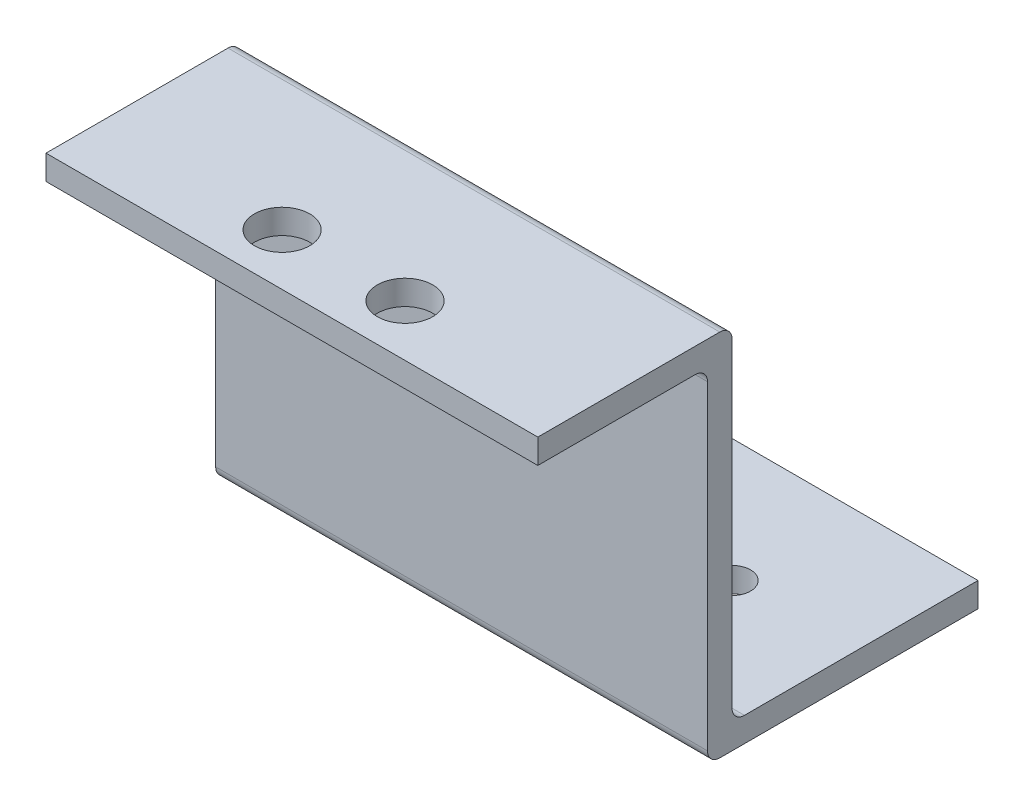
ISO-10303-21;
HEADER;
FILE_DESCRIPTION(('STEP AP214'),'2;1');
FILE_NAME('part.step','',(''),(''),'','','');
FILE_SCHEMA(('AUTOMOTIVE_DESIGN { 1 0 10303 214 1 1 1 1 }'));
ENDSEC;
DATA;
#1=APPLICATION_CONTEXT('core data for automotive mechanical design processes');
#2=APPLICATION_PROTOCOL_DEFINITION('international standard','automotive_design',2000,#1);
#3=PRODUCT_CONTEXT('',#1,'mechanical');
#4=PRODUCT('Part','Part','',(#3));
#5=PRODUCT_RELATED_PRODUCT_CATEGORY('part','',(#4));
#6=PRODUCT_DEFINITION_FORMATION('','',#4);
#7=PRODUCT_DEFINITION_CONTEXT('part definition',#1,'design');
#8=PRODUCT_DEFINITION('design','',#6,#7);
#9=PRODUCT_DEFINITION_SHAPE('','',#8);
#10=(LENGTH_UNIT() NAMED_UNIT(*) SI_UNIT(.MILLI.,.METRE.));
#11=(NAMED_UNIT(*) PLANE_ANGLE_UNIT() SI_UNIT($,.RADIAN.));
#12=(NAMED_UNIT(*) SI_UNIT($,.STERADIAN.) SOLID_ANGLE_UNIT());
#13=UNCERTAINTY_MEASURE_WITH_UNIT(LENGTH_MEASURE(1.E-05),#10,'distance_accuracy_value','');
#14=(GEOMETRIC_REPRESENTATION_CONTEXT(3) GLOBAL_UNCERTAINTY_ASSIGNED_CONTEXT((#13)) GLOBAL_UNIT_ASSIGNED_CONTEXT((#10,
#11,#12)) REPRESENTATION_CONTEXT('',''));
#15=CARTESIAN_POINT('',(0.,0.,0.));
#16=DIRECTION('',(0.,0.,1.));
#17=DIRECTION('',(1.,0.,0.));
#18=AXIS2_PLACEMENT_3D('',#15,#16,#17);
#19=CARTESIAN_POINT('',(20.7359824874377,-25.,-36.6320087562811));
#20=DIRECTION('',(1.,0.,0.));
#21=DIRECTION('',(0.,0.,-1.));
#22=AXIS2_PLACEMENT_3D('',#19,#20,#21);
#23=CYLINDRICAL_SURFACE('',#22,1.);
#24=CARTESIAN_POINT('',(-17.2640175125623,-25.,-36.6320087562811));
#25=DIRECTION('',(-1.,0.,0.));
#26=DIRECTION('',(0.,0.,1.));
#27=AXIS2_PLACEMENT_3D('',#24,#25,#26);
#28=CIRCLE('',#27,1.);
#29=CARTESIAN_POINT('',(-17.2640175125623,-25.,-35.6320087562811));
#30=VERTEX_POINT('',#29);
#31=CARTESIAN_POINT('',(-17.2640175125623,-26.,-36.6320087562811));
#32=VERTEX_POINT('',#31);
#33=EDGE_CURVE('E137',#30,#32,#28,.F.);
#34=ORIENTED_EDGE('',*,*,#33,.F.);
#35=DIRECTION('',(1.,0.,0.));
#36=VECTOR('',#35,1.);
#37=CARTESIAN_POINT('',(20.7359824874377,-25.,-35.6320087562811));
#38=LINE('',#37,#36);
#39=CARTESIAN_POINT('',(20.7359824874377,-25.,-35.6320087562811));
#40=VERTEX_POINT('',#39);
#41=EDGE_CURVE('E165',#40,#30,#38,.F.);
#42=ORIENTED_EDGE('',*,*,#41,.F.);
#43=CARTESIAN_POINT('',(20.7359824874377,-25.,-36.6320087562811));
#44=DIRECTION('',(1.,0.,0.));
#45=DIRECTION('',(0.,0.,-1.));
#46=AXIS2_PLACEMENT_3D('',#43,#44,#45);
#47=CIRCLE('',#46,1.);
#48=CARTESIAN_POINT('',(20.7359824874377,-26.,-36.6320087562811));
#49=VERTEX_POINT('',#48);
#50=EDGE_CURVE('E160',#49,#40,#47,.F.);
#51=ORIENTED_EDGE('',*,*,#50,.F.);
#52=DIRECTION('',(1.,0.,0.));
#53=VECTOR('',#52,1.);
#54=CARTESIAN_POINT('',(20.7359824874377,-26.,-36.6320087562811));
#55=LINE('',#54,#53);
#56=EDGE_CURVE('E155',#32,#49,#55,.T.);
#57=ORIENTED_EDGE('',*,*,#56,.F.);
#58=EDGE_LOOP('',(#34,#42,#51,#57));
#59=FACE_BOUND('',#58,.T.);
#60=ADVANCED_FACE('F37',(#59),#23,.F.);
#61=CARTESIAN_POINT('',(20.7359824874377,2.,0.));
#62=DIRECTION('',(1.,0.,0.));
#63=DIRECTION('',(0.,0.,-1.));
#64=AXIS2_PLACEMENT_3D('',#61,#62,#63);
#65=PLANE('',#64);
#66=DIRECTION('',(0.,0.,1.));
#67=VECTOR('',#66,1.);
#68=CARTESIAN_POINT('',(20.7359824874377,2.,0.));
#69=LINE('',#68,#67);
#70=CARTESIAN_POINT('',(20.7359824874377,2.,-34.6320087562811));
#71=VERTEX_POINT('',#70);
#72=CARTESIAN_POINT('',(20.7359824874377,2.,-19.8320087562811));
#73=VERTEX_POINT('',#72);
#74=EDGE_CURVE('E247',#71,#73,#69,.T.);
#75=ORIENTED_EDGE('',*,*,#74,.T.);
#76=DIRECTION('',(0.,-1.,0.));
#77=VECTOR('',#76,1.);
#78=CARTESIAN_POINT('',(20.7359824874377,2.,-19.8320087562811));
#79=LINE('',#78,#77);
#80=CARTESIAN_POINT('',(20.7359824874377,0.,-19.8320087562811));
#81=VERTEX_POINT('',#80);
#82=EDGE_CURVE('E259',#73,#81,#79,.T.);
#83=ORIENTED_EDGE('',*,*,#82,.T.);
#84=DIRECTION('',(0.,0.,1.));
#85=VECTOR('',#84,1.);
#86=CARTESIAN_POINT('',(20.7359824874377,0.,0.));
#87=LINE('',#86,#85);
#88=CARTESIAN_POINT('',(20.7359824874377,0.,-32.6320087562811));
#89=VERTEX_POINT('',#88);
#90=EDGE_CURVE('E186',#89,#81,#87,.T.);
#91=ORIENTED_EDGE('',*,*,#90,.F.);
#92=CARTESIAN_POINT('',(20.7359824874377,-1.,-32.6320087562811));
#93=DIRECTION('',(1.,0.,0.));
#94=DIRECTION('',(0.,0.,-1.));
#95=AXIS2_PLACEMENT_3D('',#92,#93,#94);
#96=CIRCLE('',#95,1.);
#97=CARTESIAN_POINT('',(20.7359824874377,-1.,-33.6320087562811));
#98=VERTEX_POINT('',#97);
#99=EDGE_CURVE('E45',#89,#98,#96,.F.);
#100=ORIENTED_EDGE('',*,*,#99,.T.);
#101=DIRECTION('',(0.,1.,0.));
#102=VECTOR('',#101,1.);
#103=CARTESIAN_POINT('',(20.7359824874377,-28.,-33.6320087562811));
#104=LINE('',#103,#102);
#105=CARTESIAN_POINT('',(20.7359824874377,-27.,-33.6320087562811));
#106=VERTEX_POINT('',#105);
#107=EDGE_CURVE('E184',#106,#98,#104,.T.);
#108=ORIENTED_EDGE('',*,*,#107,.F.);
#109=CARTESIAN_POINT('',(20.7359824874377,-27.,-34.6320087562811));
#110=DIRECTION('',(1.,0.,0.));
#111=DIRECTION('',(0.,0.,-1.));
#112=AXIS2_PLACEMENT_3D('',#109,#110,#111);
#113=CIRCLE('',#112,1.);
#114=CARTESIAN_POINT('',(20.7359824874377,-28.,-34.6320087562811));
#115=VERTEX_POINT('',#114);
#116=EDGE_CURVE('E210',#106,#115,#113,.T.);
#117=ORIENTED_EDGE('',*,*,#116,.T.);
#118=DIRECTION('',(0.,0.,-1.));
#119=VECTOR('',#118,1.);
#120=CARTESIAN_POINT('',(20.7359824874377,-28.,-33.6320087562811));
#121=LINE('',#120,#119);
#122=CARTESIAN_POINT('',(20.7359824874377,-28.,-55.6320087562811));
#123=VERTEX_POINT('',#122);
#124=EDGE_CURVE('E237',#115,#123,#121,.T.);
#125=ORIENTED_EDGE('',*,*,#124,.T.);
#126=DIRECTION('',(0.,-1.,0.));
#127=VECTOR('',#126,1.);
#128=CARTESIAN_POINT('',(20.7359824874377,-28.,-55.6320087562811));
#129=LINE('',#128,#127);
#130=CARTESIAN_POINT('',(20.7359824874377,-26.,-55.6320087562811));
#131=VERTEX_POINT('',#130);
#132=EDGE_CURVE('E320',#131,#123,#129,.T.);
#133=ORIENTED_EDGE('',*,*,#132,.F.);
#134=DIRECTION('',(0.,0.,1.));
#135=VECTOR('',#134,1.);
#136=CARTESIAN_POINT('',(20.7359824874377,-26.,-55.6320087562811));
#137=LINE('',#136,#135);
#138=EDGE_CURVE('E311',#131,#49,#137,.T.);
#139=ORIENTED_EDGE('',*,*,#138,.T.);
#140=ORIENTED_EDGE('',*,*,#50,.T.);
#141=DIRECTION('',(0.,1.,0.));
#142=VECTOR('',#141,1.);
#143=CARTESIAN_POINT('',(20.7359824874377,-28.,-35.6320087562811));
#144=LINE('',#143,#142);
#145=CARTESIAN_POINT('',(20.7359824874377,1.,-35.6320087562811));
#146=VERTEX_POINT('',#145);
#147=EDGE_CURVE('E231',#40,#146,#144,.T.);
#148=ORIENTED_EDGE('',*,*,#147,.T.);
#149=CARTESIAN_POINT('',(20.7359824874377,1.,-34.6320087562811));
#150=DIRECTION('',(1.,0.,0.));
#151=DIRECTION('',(0.,0.,-1.));
#152=AXIS2_PLACEMENT_3D('',#149,#150,#151);
#153=CIRCLE('',#152,1.);
#154=EDGE_CURVE('E202',#146,#71,#153,.T.);
#155=ORIENTED_EDGE('',*,*,#154,.T.);
#156=EDGE_LOOP('',(#75,#83,#91,#100,#108,#117,#125,#133,#139,#140,#148,#155));
#157=FACE_BOUND('',#156,.T.);
#158=ADVANCED_FACE('F183',(#157),#65,.T.);
#159=CARTESIAN_POINT('',(-19.2640175125623,2.,0.));
#160=DIRECTION('',(1.,0.,0.));
#161=DIRECTION('',(0.,0.,-1.));
#162=AXIS2_PLACEMENT_3D('',#159,#160,#161);
#163=PLANE('',#162);
#164=DIRECTION('',(0.,1.,0.));
#165=VECTOR('',#164,1.);
#166=CARTESIAN_POINT('',(-19.2640175125623,-28.,-35.6320087562811));
#167=LINE('',#166,#165);
#168=CARTESIAN_POINT('',(-19.2640175125623,-16.,-35.6320087562811));
#169=VERTEX_POINT('',#168);
#170=CARTESIAN_POINT('',(-19.2640175125623,1.,-35.6320087562811));
#171=VERTEX_POINT('',#170);
#172=EDGE_CURVE('E219',#169,#171,#167,.T.);
#173=ORIENTED_EDGE('',*,*,#172,.F.);
#174=DIRECTION('',(0.,-0.707106781186548,-0.707106781186548));
#175=VECTOR('',#174,1.);
#176=CARTESIAN_POINT('',(-19.2640175125623,9.81600437814057,-9.81600437814057));
#177=LINE('',#176,#175);
#178=CARTESIAN_POINT('',(-19.2640175125623,-26.,-45.6320087562811));
#179=VERTEX_POINT('',#178);
#180=EDGE_CURVE('E158',#169,#179,#177,.T.);
#181=ORIENTED_EDGE('',*,*,#180,.T.);
#182=DIRECTION('',(0.,0.,1.));
#183=VECTOR('',#182,1.);
#184=CARTESIAN_POINT('',(-19.2640175125623,-26.,-55.6320087562811));
#185=LINE('',#184,#183);
#186=CARTESIAN_POINT('',(-19.2640175125623,-26.,-55.6320087562811));
#187=VERTEX_POINT('',#186);
#188=EDGE_CURVE('E309',#187,#179,#185,.T.);
#189=ORIENTED_EDGE('',*,*,#188,.F.);
#190=DIRECTION('',(0.,1.,0.));
#191=VECTOR('',#190,1.);
#192=CARTESIAN_POINT('',(-19.2640175125623,-28.,-55.6320087562811));
#193=LINE('',#192,#191);
#194=CARTESIAN_POINT('',(-19.2640175125623,-28.,-55.6320087562811));
#195=VERTEX_POINT('',#194);
#196=EDGE_CURVE('E315',#195,#187,#193,.T.);
#197=ORIENTED_EDGE('',*,*,#196,.F.);
#198=DIRECTION('',(0.,0.,1.));
#199=VECTOR('',#198,1.);
#200=CARTESIAN_POINT('',(-19.2640175125623,-28.,-33.6320087562811));
#201=LINE('',#200,#199);
#202=CARTESIAN_POINT('',(-19.2640175125623,-28.,-34.6320087562811));
#203=VERTEX_POINT('',#202);
#204=EDGE_CURVE('E233',#195,#203,#201,.T.);
#205=ORIENTED_EDGE('',*,*,#204,.T.);
#206=CARTESIAN_POINT('',(-19.2640175125623,-27.,-34.6320087562811));
#207=DIRECTION('',(1.,0.,0.));
#208=DIRECTION('',(0.,0.,-1.));
#209=AXIS2_PLACEMENT_3D('',#206,#207,#208);
#210=CIRCLE('',#209,1.);
#211=CARTESIAN_POINT('',(-19.2640175125623,-27.,-33.6320087562811));
#212=VERTEX_POINT('',#211);
#213=EDGE_CURVE('E163',#203,#212,#210,.F.);
#214=ORIENTED_EDGE('',*,*,#213,.T.);
#215=DIRECTION('',(0.,1.,0.));
#216=VECTOR('',#215,1.);
#217=CARTESIAN_POINT('',(-19.2640175125623,-28.,-33.6320087562811));
#218=LINE('',#217,#216);
#219=CARTESIAN_POINT('',(-19.2640175125623,-1.,-33.6320087562811));
#220=VERTEX_POINT('',#219);
#221=EDGE_CURVE('E198',#212,#220,#218,.T.);
#222=ORIENTED_EDGE('',*,*,#221,.T.);
#223=CARTESIAN_POINT('',(-19.2640175125623,-1.,-32.6320087562811));
#224=DIRECTION('',(1.,0.,0.));
#225=DIRECTION('',(0.,0.,-1.));
#226=AXIS2_PLACEMENT_3D('',#223,#224,#225);
#227=CIRCLE('',#226,1.);
#228=CARTESIAN_POINT('',(-19.2640175125623,0.,-32.6320087562811));
#229=VERTEX_POINT('',#228);
#230=EDGE_CURVE('E11',#220,#229,#227,.T.);
#231=ORIENTED_EDGE('',*,*,#230,.T.);
#232=DIRECTION('',(0.,0.,1.));
#233=VECTOR('',#232,1.);
#234=CARTESIAN_POINT('',(-19.2640175125623,0.,0.));
#235=LINE('',#234,#233);
#236=CARTESIAN_POINT('',(-19.2640175125623,0.,-19.8320087562811));
#237=VERTEX_POINT('',#236);
#238=EDGE_CURVE('E255',#229,#237,#235,.T.);
#239=ORIENTED_EDGE('',*,*,#238,.T.);
#240=DIRECTION('',(0.,-1.,0.));
#241=VECTOR('',#240,1.);
#242=CARTESIAN_POINT('',(-19.2640175125623,2.,-19.8320087562811));
#243=LINE('',#242,#241);
#244=CARTESIAN_POINT('',(-19.2640175125623,2.,-19.8320087562811));
#245=VERTEX_POINT('',#244);
#246=EDGE_CURVE('E260',#245,#237,#243,.T.);
#247=ORIENTED_EDGE('',*,*,#246,.F.);
#248=DIRECTION('',(0.,0.,1.));
#249=VECTOR('',#248,1.);
#250=CARTESIAN_POINT('',(-19.2640175125623,2.,0.));
#251=LINE('',#250,#249);
#252=CARTESIAN_POINT('',(-19.2640175125623,2.,-34.6320087562811));
#253=VERTEX_POINT('',#252);
#254=EDGE_CURVE('E204',#253,#245,#251,.T.);
#255=ORIENTED_EDGE('',*,*,#254,.F.);
#256=CARTESIAN_POINT('',(-19.2640175125623,1.,-34.6320087562811));
#257=DIRECTION('',(1.,0.,0.));
#258=DIRECTION('',(0.,0.,-1.));
#259=AXIS2_PLACEMENT_3D('',#256,#257,#258);
#260=CIRCLE('',#259,1.);
#261=EDGE_CURVE('E167',#253,#171,#260,.F.);
#262=ORIENTED_EDGE('',*,*,#261,.T.);
#263=EDGE_LOOP('',(#173,#181,#189,#197,#205,#214,#222,#231,#239,#247,#255,#262));
#264=FACE_BOUND('',#263,.T.);
#265=ADVANCED_FACE('F217',(#264),#163,.F.);
#266=CARTESIAN_POINT('',(0.,2.,0.));
#267=DIRECTION('',(0.,1.,0.));
#268=DIRECTION('',(0.,0.,1.));
#269=AXIS2_PLACEMENT_3D('',#266,#267,#268);
#270=PLANE('',#269);
#271=DIRECTION('',(-1.,0.,0.));
#272=VECTOR('',#271,1.);
#273=CARTESIAN_POINT('',(0.,2.,-19.8320087562811));
#274=LINE('',#273,#272);
#275=EDGE_CURVE('E200',#73,#245,#274,.T.);
#276=ORIENTED_EDGE('',*,*,#275,.F.);
#277=ORIENTED_EDGE('',*,*,#74,.F.);
#278=DIRECTION('',(-1.,0.,0.));
#279=VECTOR('',#278,1.);
#280=CARTESIAN_POINT('',(0.,2.,-34.6320087562811));
#281=LINE('',#280,#279);
#282=EDGE_CURVE('E172',#71,#253,#281,.T.);
#283=ORIENTED_EDGE('',*,*,#282,.T.);
#284=ORIENTED_EDGE('',*,*,#254,.T.);
#285=EDGE_LOOP('',(#276,#277,#283,#284));
#286=FACE_BOUND('',#285,.T.);
#287=CARTESIAN_POINT('',(-4.26401751256228,2.,-24.0320087562811));
#288=DIRECTION('',(0.,1.,0.));
#289=DIRECTION('',(0.,0.,1.));
#290=AXIS2_PLACEMENT_3D('',#287,#288,#289);
#291=CIRCLE('',#290,2.25);
#292=CARTESIAN_POINT('',(-4.26401751256228,2.,-21.7820087562811));
#293=VERTEX_POINT('',#292);
#294=EDGE_CURVE('E244',#293,#293,#291,.T.);
#295=ORIENTED_EDGE('',*,*,#294,.F.);
#296=EDGE_LOOP('',(#295));
#297=FACE_BOUND('',#296,.T.);
#298=CARTESIAN_POINT('',(5.73598248743772,2.,-24.0320087562811));
#299=DIRECTION('',(0.,1.,0.));
#300=DIRECTION('',(0.,0.,1.));
#301=AXIS2_PLACEMENT_3D('',#298,#299,#300);
#302=CIRCLE('',#301,2.25000000000001);
#303=CARTESIAN_POINT('',(5.73598248743772,2.,-21.7820087562811));
#304=VERTEX_POINT('',#303);
#305=EDGE_CURVE('E241',#304,#304,#302,.T.);
#306=ORIENTED_EDGE('',*,*,#305,.F.);
#307=EDGE_LOOP('',(#306));
#308=FACE_BOUND('',#307,.T.);
#309=ADVANCED_FACE('F265',(#286,#297,#308),#270,.T.);
#310=CARTESIAN_POINT('',(0.,0.,0.));
#311=DIRECTION('',(0.,1.,0.));
#312=DIRECTION('',(0.,0.,1.));
#313=AXIS2_PLACEMENT_3D('',#310,#311,#312);
#314=PLANE('',#313);
#315=DIRECTION('',(1.,0.,0.));
#316=VECTOR('',#315,1.);
#317=CARTESIAN_POINT('',(0.,0.,-19.8320087562811));
#318=LINE('',#317,#316);
#319=EDGE_CURVE('E52',#237,#81,#318,.T.);
#320=ORIENTED_EDGE('',*,*,#319,.F.);
#321=ORIENTED_EDGE('',*,*,#238,.F.);
#322=DIRECTION('',(1.,0.,0.));
#323=VECTOR('',#322,1.);
#324=CARTESIAN_POINT('',(0.,0.,-32.6320087562811));
#325=LINE('',#324,#323);
#326=EDGE_CURVE('E175',#229,#89,#325,.T.);
#327=ORIENTED_EDGE('',*,*,#326,.T.);
#328=ORIENTED_EDGE('',*,*,#90,.T.);
#329=EDGE_LOOP('',(#320,#321,#327,#328));
#330=FACE_BOUND('',#329,.T.);
#331=CARTESIAN_POINT('',(-4.26401751256228,0.,-24.0320087562811));
#332=DIRECTION('',(0.,1.,0.));
#333=DIRECTION('',(0.,0.,1.));
#334=AXIS2_PLACEMENT_3D('',#331,#332,#333);
#335=CIRCLE('',#334,2.25);
#336=CARTESIAN_POINT('',(-4.26401751256228,0.,-21.7820087562811));
#337=VERTEX_POINT('',#336);
#338=EDGE_CURVE('E252',#337,#337,#335,.T.);
#339=ORIENTED_EDGE('',*,*,#338,.T.);
#340=EDGE_LOOP('',(#339));
#341=FACE_BOUND('',#340,.T.);
#342=CARTESIAN_POINT('',(5.73598248743772,0.,-24.0320087562811));
#343=DIRECTION('',(0.,1.,0.));
#344=DIRECTION('',(0.,0.,1.));
#345=AXIS2_PLACEMENT_3D('',#342,#343,#344);
#346=CIRCLE('',#345,2.25000000000001);
#347=CARTESIAN_POINT('',(5.73598248743772,0.,-21.7820087562811));
#348=VERTEX_POINT('',#347);
#349=EDGE_CURVE('E197',#348,#348,#346,.T.);
#350=ORIENTED_EDGE('',*,*,#349,.T.);
#351=EDGE_LOOP('',(#350));
#352=FACE_BOUND('',#351,.T.);
#353=ADVANCED_FACE('F262',(#330,#341,#352),#314,.F.);
#354=CARTESIAN_POINT('',(0.,2.,-19.8320087562811));
#355=DIRECTION('',(0.,0.,-1.));
#356=DIRECTION('',(-1.,0.,0.));
#357=AXIS2_PLACEMENT_3D('',#354,#355,#356);
#358=PLANE('',#357);
#359=ORIENTED_EDGE('',*,*,#319,.T.);
#360=ORIENTED_EDGE('',*,*,#82,.F.);
#361=ORIENTED_EDGE('',*,*,#275,.T.);
#362=ORIENTED_EDGE('',*,*,#246,.T.);
#363=EDGE_LOOP('',(#359,#360,#361,#362));
#364=FACE_BOUND('',#363,.T.);
#365=ADVANCED_FACE('F258',(#364),#358,.F.);
#366=CARTESIAN_POINT('',(-4.26401751256228,2.,-24.0320087562811));
#367=DIRECTION('',(0.,-1.,0.));
#368=DIRECTION('',(0.,0.,-1.));
#369=AXIS2_PLACEMENT_3D('',#366,#367,#368);
#370=CYLINDRICAL_SURFACE('',#369,2.25);
#371=ORIENTED_EDGE('',*,*,#294,.T.);
#372=EDGE_LOOP('',(#371));
#373=FACE_BOUND('',#372,.T.);
#374=ORIENTED_EDGE('',*,*,#338,.F.);
#375=EDGE_LOOP('',(#374));
#376=FACE_BOUND('',#375,.T.);
#377=ADVANCED_FACE('F273',(#373,#376),#370,.F.);
#378=CARTESIAN_POINT('',(5.73598248743772,2.,-24.0320087562811));
#379=DIRECTION('',(0.,-1.,0.));
#380=DIRECTION('',(0.,0.,-1.));
#381=AXIS2_PLACEMENT_3D('',#378,#379,#380);
#382=CYLINDRICAL_SURFACE('',#381,2.25000000000001);
#383=ORIENTED_EDGE('',*,*,#305,.T.);
#384=EDGE_LOOP('',(#383));
#385=FACE_BOUND('',#384,.T.);
#386=ORIENTED_EDGE('',*,*,#349,.F.);
#387=EDGE_LOOP('',(#386));
#388=FACE_BOUND('',#387,.T.);
#389=ADVANCED_FACE('F271',(#385,#388),#382,.F.);
#390=CARTESIAN_POINT('',(20.7359824874377,-28.,-33.6320087562811));
#391=DIRECTION('',(0.,0.,1.));
#392=DIRECTION('',(1.,0.,0.));
#393=AXIS2_PLACEMENT_3D('',#390,#391,#392);
#394=PLANE('',#393);
#395=ORIENTED_EDGE('',*,*,#221,.F.);
#396=DIRECTION('',(1.,0.,0.));
#397=VECTOR('',#396,1.);
#398=CARTESIAN_POINT('',(20.7359824874377,-27.,-33.6320087562811));
#399=LINE('',#398,#397);
#400=EDGE_CURVE('E196',#212,#106,#399,.T.);
#401=ORIENTED_EDGE('',*,*,#400,.T.);
#402=ORIENTED_EDGE('',*,*,#107,.T.);
#403=DIRECTION('',(1.,0.,0.));
#404=VECTOR('',#403,1.);
#405=CARTESIAN_POINT('',(20.7359824874377,-1.,-33.6320087562811));
#406=LINE('',#405,#404);
#407=EDGE_CURVE('E194',#98,#220,#406,.F.);
#408=ORIENTED_EDGE('',*,*,#407,.T.);
#409=EDGE_LOOP('',(#395,#401,#402,#408));
#410=FACE_BOUND('',#409,.T.);
#411=ADVANCED_FACE('F193',(#410),#394,.T.);
#412=CARTESIAN_POINT('',(20.7359824874377,-28.,-35.6320087562811));
#413=DIRECTION('',(0.,0.,-1.));
#414=DIRECTION('',(-1.,0.,0.));
#415=AXIS2_PLACEMENT_3D('',#412,#413,#414);
#416=PLANE('',#415);
#417=DIRECTION('',(-1.,0.,0.));
#418=VECTOR('',#417,1.);
#419=CARTESIAN_POINT('',(-17.2640175125623,-16.,-35.6320087562811));
#420=LINE('',#419,#418);
#421=CARTESIAN_POINT('',(-17.2640175125623,-16.,-35.6320087562811));
#422=VERTEX_POINT('',#421);
#423=EDGE_CURVE('E336',#422,#169,#420,.T.);
#424=ORIENTED_EDGE('',*,*,#423,.T.);
#425=ORIENTED_EDGE('',*,*,#172,.T.);
#426=DIRECTION('',(-1.,0.,0.));
#427=VECTOR('',#426,1.);
#428=CARTESIAN_POINT('',(20.7359824874377,1.,-35.6320087562811));
#429=LINE('',#428,#427);
#430=EDGE_CURVE('E162',#171,#146,#429,.F.);
#431=ORIENTED_EDGE('',*,*,#430,.T.);
#432=ORIENTED_EDGE('',*,*,#147,.F.);
#433=ORIENTED_EDGE('',*,*,#41,.T.);
#434=DIRECTION('',(0.,-1.,0.));
#435=VECTOR('',#434,1.);
#436=CARTESIAN_POINT('',(-17.2640175125623,0.,-35.6320087562811));
#437=LINE('',#436,#435);
#438=EDGE_CURVE('E144',#422,#30,#437,.T.);
#439=ORIENTED_EDGE('',*,*,#438,.F.);
#440=EDGE_LOOP('',(#424,#425,#431,#432,#433,#439));
#441=FACE_BOUND('',#440,.T.);
#442=ADVANCED_FACE('F230',(#441),#416,.T.);
#443=CARTESIAN_POINT('',(0.,-28.,0.));
#444=DIRECTION('',(0.,1.,0.));
#445=DIRECTION('',(0.,0.,1.));
#446=AXIS2_PLACEMENT_3D('',#443,#444,#445);
#447=PLANE('',#446);
#448=CARTESIAN_POINT('',(-9.26401751256228,-28.,-45.6320087562811));
#449=DIRECTION('',(0.,1.,0.));
#450=DIRECTION('',(0.,0.,1.));
#451=AXIS2_PLACEMENT_3D('',#448,#449,#450);
#452=CIRCLE('',#451,1.5);
#453=CARTESIAN_POINT('',(-9.26401751256228,-28.,-44.1320087562811));
#454=VERTEX_POINT('',#453);
#455=EDGE_CURVE('E323',#454,#454,#452,.T.);
#456=ORIENTED_EDGE('',*,*,#455,.T.);
#457=EDGE_LOOP('',(#456));
#458=FACE_BOUND('',#457,.T.);
#459=CARTESIAN_POINT('',(10.7359824874377,-28.,-45.6320087562811));
#460=DIRECTION('',(0.,1.,0.));
#461=DIRECTION('',(0.,0.,1.));
#462=AXIS2_PLACEMENT_3D('',#459,#460,#461);
#463=CIRCLE('',#462,1.5);
#464=CARTESIAN_POINT('',(10.7359824874377,-28.,-44.1320087562811));
#465=VERTEX_POINT('',#464);
#466=EDGE_CURVE('E326',#465,#465,#463,.T.);
#467=ORIENTED_EDGE('',*,*,#466,.T.);
#468=EDGE_LOOP('',(#467));
#469=FACE_BOUND('',#468,.T.);
#470=ORIENTED_EDGE('',*,*,#124,.F.);
#471=DIRECTION('',(1.,0.,0.));
#472=VECTOR('',#471,1.);
#473=CARTESIAN_POINT('',(-19.2640175125623,-28.,-34.6320087562811));
#474=LINE('',#473,#472);
#475=EDGE_CURVE('E212',#115,#203,#474,.F.);
#476=ORIENTED_EDGE('',*,*,#475,.T.);
#477=ORIENTED_EDGE('',*,*,#204,.F.);
#478=DIRECTION('',(-1.,0.,0.));
#479=VECTOR('',#478,1.);
#480=CARTESIAN_POINT('',(20.7359824874377,-28.,-55.6320087562811));
#481=LINE('',#480,#479);
#482=EDGE_CURVE('E317',#123,#195,#481,.T.);
#483=ORIENTED_EDGE('',*,*,#482,.F.);
#484=EDGE_LOOP('',(#470,#476,#477,#483));
#485=FACE_BOUND('',#484,.T.);
#486=ADVANCED_FACE('F350',(#458,#469,#485),#447,.F.);
#487=CARTESIAN_POINT('',(20.7359824874377,-26.,-55.6320087562811));
#488=DIRECTION('',(0.,-1.,0.));
#489=DIRECTION('',(0.,0.,-1.));
#490=AXIS2_PLACEMENT_3D('',#487,#488,#489);
#491=PLANE('',#490);
#492=CARTESIAN_POINT('',(-9.26401751256228,-26.,-45.6320087562811));
#493=DIRECTION('',(0.,1.,0.));
#494=DIRECTION('',(0.,0.,1.));
#495=AXIS2_PLACEMENT_3D('',#492,#493,#494);
#496=CIRCLE('',#495,1.5);
#497=CARTESIAN_POINT('',(-9.26401751256228,-26.,-44.1320087562811));
#498=VERTEX_POINT('',#497);
#499=EDGE_CURVE('E329',#498,#498,#496,.T.);
#500=ORIENTED_EDGE('',*,*,#499,.F.);
#501=EDGE_LOOP('',(#500));
#502=FACE_BOUND('',#501,.T.);
#503=CARTESIAN_POINT('',(10.7359824874377,-26.,-45.6320087562811));
#504=DIRECTION('',(0.,1.,0.));
#505=DIRECTION('',(0.,0.,1.));
#506=AXIS2_PLACEMENT_3D('',#503,#504,#505);
#507=CIRCLE('',#506,1.5);
#508=CARTESIAN_POINT('',(10.7359824874377,-26.,-44.1320087562811));
#509=VERTEX_POINT('',#508);
#510=EDGE_CURVE('E330',#509,#509,#507,.T.);
#511=ORIENTED_EDGE('',*,*,#510,.F.);
#512=EDGE_LOOP('',(#511));
#513=FACE_BOUND('',#512,.T.);
#514=ORIENTED_EDGE('',*,*,#188,.T.);
#515=DIRECTION('',(-1.,0.,0.));
#516=VECTOR('',#515,1.);
#517=CARTESIAN_POINT('',(-17.2640175125623,-26.,-45.6320087562811));
#518=LINE('',#517,#516);
#519=CARTESIAN_POINT('',(-17.2640175125623,-26.,-45.6320087562811));
#520=VERTEX_POINT('',#519);
#521=EDGE_CURVE('E157',#520,#179,#518,.T.);
#522=ORIENTED_EDGE('',*,*,#521,.F.);
#523=DIRECTION('',(0.,0.,-1.));
#524=VECTOR('',#523,1.);
#525=CARTESIAN_POINT('',(-17.2640175125623,-26.,0.));
#526=LINE('',#525,#524);
#527=EDGE_CURVE('E141',#32,#520,#526,.T.);
#528=ORIENTED_EDGE('',*,*,#527,.F.);
#529=ORIENTED_EDGE('',*,*,#56,.T.);
#530=ORIENTED_EDGE('',*,*,#138,.F.);
#531=DIRECTION('',(1.,0.,0.));
#532=VECTOR('',#531,1.);
#533=CARTESIAN_POINT('',(20.7359824874377,-26.,-55.6320087562811));
#534=LINE('',#533,#532);
#535=EDGE_CURVE('E313',#187,#131,#534,.T.);
#536=ORIENTED_EDGE('',*,*,#535,.F.);
#537=EDGE_LOOP('',(#514,#522,#528,#529,#530,#536));
#538=FACE_BOUND('',#537,.T.);
#539=ADVANCED_FACE('F153',(#502,#513,#538),#491,.F.);
#540=CARTESIAN_POINT('',(0.,0.,-55.6320087562811));
#541=DIRECTION('',(0.,0.,1.));
#542=DIRECTION('',(1.,0.,0.));
#543=AXIS2_PLACEMENT_3D('',#540,#541,#542);
#544=PLANE('',#543);
#545=ORIENTED_EDGE('',*,*,#132,.T.);
#546=ORIENTED_EDGE('',*,*,#482,.T.);
#547=ORIENTED_EDGE('',*,*,#196,.T.);
#548=ORIENTED_EDGE('',*,*,#535,.T.);
#549=EDGE_LOOP('',(#545,#546,#547,#548));
#550=FACE_BOUND('',#549,.T.);
#551=ADVANCED_FACE('F297',(#550),#544,.F.);
#552=CARTESIAN_POINT('',(20.7359824874377,-27.,-34.6320087562811));
#553=DIRECTION('',(-1.,0.,0.));
#554=DIRECTION('',(0.,0.,1.));
#555=AXIS2_PLACEMENT_3D('',#552,#553,#554);
#556=CYLINDRICAL_SURFACE('',#555,1.);
#557=ORIENTED_EDGE('',*,*,#213,.F.);
#558=ORIENTED_EDGE('',*,*,#475,.F.);
#559=ORIENTED_EDGE('',*,*,#116,.F.);
#560=ORIENTED_EDGE('',*,*,#400,.F.);
#561=EDGE_LOOP('',(#557,#558,#559,#560));
#562=FACE_BOUND('',#561,.T.);
#563=ADVANCED_FACE('F290',(#562),#556,.T.);
#564=CARTESIAN_POINT('',(0.,1.,-34.6320087562811));
#565=DIRECTION('',(-1.,0.,0.));
#566=DIRECTION('',(0.,0.,1.));
#567=AXIS2_PLACEMENT_3D('',#564,#565,#566);
#568=CYLINDRICAL_SURFACE('',#567,1.);
#569=ORIENTED_EDGE('',*,*,#154,.F.);
#570=ORIENTED_EDGE('',*,*,#430,.F.);
#571=ORIENTED_EDGE('',*,*,#261,.F.);
#572=ORIENTED_EDGE('',*,*,#282,.F.);
#573=EDGE_LOOP('',(#569,#570,#571,#572));
#574=FACE_BOUND('',#573,.T.);
#575=ADVANCED_FACE('F225',(#574),#568,.T.);
#576=CARTESIAN_POINT('',(0.,-1.,-32.6320087562811));
#577=DIRECTION('',(1.,0.,0.));
#578=DIRECTION('',(0.,0.,-1.));
#579=AXIS2_PLACEMENT_3D('',#576,#577,#578);
#580=CYLINDRICAL_SURFACE('',#579,1.);
#581=ORIENTED_EDGE('',*,*,#230,.F.);
#582=ORIENTED_EDGE('',*,*,#407,.F.);
#583=ORIENTED_EDGE('',*,*,#99,.F.);
#584=ORIENTED_EDGE('',*,*,#326,.F.);
#585=EDGE_LOOP('',(#581,#582,#583,#584));
#586=FACE_BOUND('',#585,.T.);
#587=ADVANCED_FACE('F39',(#586),#580,.F.);
#588=CARTESIAN_POINT('',(10.7359824874377,-46.,-45.6320087562811));
#589=DIRECTION('',(0.,1.,0.));
#590=DIRECTION('',(0.,0.,1.));
#591=AXIS2_PLACEMENT_3D('',#588,#589,#590);
#592=CYLINDRICAL_SURFACE('',#591,1.5);
#593=ORIENTED_EDGE('',*,*,#510,.T.);
#594=EDGE_LOOP('',(#593));
#595=FACE_BOUND('',#594,.T.);
#596=ORIENTED_EDGE('',*,*,#466,.F.);
#597=EDGE_LOOP('',(#596));
#598=FACE_BOUND('',#597,.T.);
#599=ADVANCED_FACE('F296',(#595,#598),#592,.F.);
#600=CARTESIAN_POINT('',(-9.26401751256228,-46.,-45.6320087562811));
#601=DIRECTION('',(0.,1.,0.));
#602=DIRECTION('',(0.,0.,1.));
#603=AXIS2_PLACEMENT_3D('',#600,#601,#602);
#604=CYLINDRICAL_SURFACE('',#603,1.5);
#605=ORIENTED_EDGE('',*,*,#499,.T.);
#606=EDGE_LOOP('',(#605));
#607=FACE_BOUND('',#606,.T.);
#608=ORIENTED_EDGE('',*,*,#455,.F.);
#609=EDGE_LOOP('',(#608));
#610=FACE_BOUND('',#609,.T.);
#611=ADVANCED_FACE('F437',(#607,#610),#604,.F.);
#612=CARTESIAN_POINT('',(-17.2640175125623,9.81600437814057,-9.81600437814057));
#613=DIRECTION('',(0.,0.707106781186547,-0.707106781186547));
#614=DIRECTION('',(0.,0.707106781186548,0.707106781186548));
#615=AXIS2_PLACEMENT_3D('',#612,#613,#614);
#616=PLANE('',#615);
#617=ORIENTED_EDGE('',*,*,#180,.F.);
#618=ORIENTED_EDGE('',*,*,#423,.F.);
#619=DIRECTION('',(0.,-0.707106781186548,-0.707106781186548));
#620=VECTOR('',#619,1.);
#621=CARTESIAN_POINT('',(-17.2640175125623,9.81600437814057,-9.81600437814057));
#622=LINE('',#621,#620);
#623=EDGE_CURVE('E338',#422,#520,#622,.T.);
#624=ORIENTED_EDGE('',*,*,#623,.T.);
#625=ORIENTED_EDGE('',*,*,#521,.T.);
#626=EDGE_LOOP('',(#617,#618,#624,#625));
#627=FACE_BOUND('',#626,.T.);
#628=ADVANCED_FACE('F343',(#627),#616,.T.);
#629=CARTESIAN_POINT('',(-17.2640175125623,0.,0.));
#630=DIRECTION('',(-1.,0.,0.));
#631=DIRECTION('',(0.,0.,1.));
#632=AXIS2_PLACEMENT_3D('',#629,#630,#631);
#633=PLANE('',#632);
#634=ORIENTED_EDGE('',*,*,#527,.T.);
#635=ORIENTED_EDGE('',*,*,#623,.F.);
#636=ORIENTED_EDGE('',*,*,#438,.T.);
#637=ORIENTED_EDGE('',*,*,#33,.T.);
#638=EDGE_LOOP('',(#634,#635,#636,#637));
#639=FACE_BOUND('',#638,.T.);
#640=ADVANCED_FACE('F139',(#639),#633,.F.);
#641=CLOSED_SHELL('',(#60,#158,#265,#309,#353,#365,#377,#389,#411,#442,#486,#539,#551,#563,#575,
#587,#599,#611,#628,#640));
#642=MANIFOLD_SOLID_BREP('B2',#641);
#643=ADVANCED_BREP_SHAPE_REPRESENTATION('',(#18,#642),#14);
#644=SHAPE_DEFINITION_REPRESENTATION(#9,#643);
ENDSEC;
END-ISO-10303-21;
